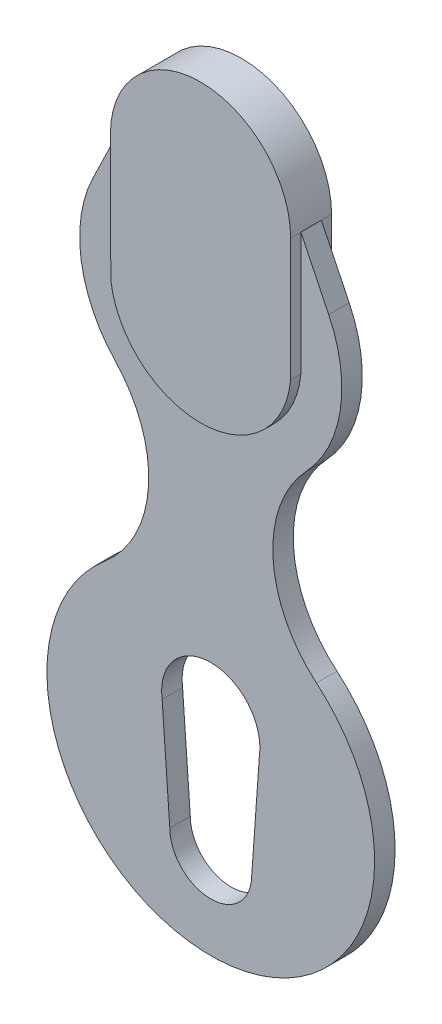
ISO-10303-21;
HEADER;
FILE_DESCRIPTION(('STEP AP214'),'2;1');
FILE_NAME('part.step','',(''),(''),'','','');
FILE_SCHEMA(('AUTOMOTIVE_DESIGN { 1 0 10303 214 1 1 1 1 }'));
ENDSEC;
DATA;
#1=APPLICATION_CONTEXT('core data for automotive mechanical design processes');
#2=APPLICATION_PROTOCOL_DEFINITION('international standard','automotive_design',2000,#1);
#3=PRODUCT_CONTEXT('',#1,'mechanical');
#4=PRODUCT('Part','Part','',(#3));
#5=PRODUCT_RELATED_PRODUCT_CATEGORY('part','',(#4));
#6=PRODUCT_DEFINITION_FORMATION('','',#4);
#7=PRODUCT_DEFINITION_CONTEXT('part definition',#1,'design');
#8=PRODUCT_DEFINITION('design','',#6,#7);
#9=PRODUCT_DEFINITION_SHAPE('','',#8);
#10=(LENGTH_UNIT() NAMED_UNIT(*) SI_UNIT(.MILLI.,.METRE.));
#11=(NAMED_UNIT(*) PLANE_ANGLE_UNIT() SI_UNIT($,.RADIAN.));
#12=(NAMED_UNIT(*) SI_UNIT($,.STERADIAN.) SOLID_ANGLE_UNIT());
#13=UNCERTAINTY_MEASURE_WITH_UNIT(LENGTH_MEASURE(1.E-05),#10,'distance_accuracy_value','');
#14=(GEOMETRIC_REPRESENTATION_CONTEXT(3) GLOBAL_UNCERTAINTY_ASSIGNED_CONTEXT((#13)) GLOBAL_UNIT_ASSIGNED_CONTEXT((#10,
#11,#12)) REPRESENTATION_CONTEXT('',''));
#15=CARTESIAN_POINT('',(0.,0.,0.));
#16=DIRECTION('',(0.,0.,1.));
#17=DIRECTION('',(1.,0.,0.));
#18=AXIS2_PLACEMENT_3D('',#15,#16,#17);
#19=CARTESIAN_POINT('',(-21.6093115242369,-0.0680474075163248,5.));
#20=DIRECTION('',(0.9999950419822,0.0031489698345894,0.));
#21=DIRECTION('',(-0.0031489698345894,0.9999950419822,0.));
#22=AXIS2_PLACEMENT_3D('',#19,#20,#21);
#23=PLANE('',#22);
#24=DIRECTION('',(0.0031489698345894,-0.999995041982199,0.));
#25=VECTOR('',#24,1.);
#26=CARTESIAN_POINT('',(-21.6093115242369,-0.0680474075163248,-2.5));
#27=LINE('',#26,#25);
#28=CARTESIAN_POINT('',(-22.,124.,-2.5));
#29=VERTEX_POINT('',#28);
#30=CARTESIAN_POINT('',(-21.9027734926598,93.1244977257462,-2.5));
#31=VERTEX_POINT('',#30);
#32=EDGE_CURVE('E277',#29,#31,#27,.T.);
#33=ORIENTED_EDGE('',*,*,#32,.F.);
#34=DIRECTION('',(0.,0.,-1.));
#35=VECTOR('',#34,1.);
#36=CARTESIAN_POINT('',(-22.,124.,5.));
#37=LINE('',#36,#35);
#38=CARTESIAN_POINT('',(-22.,124.,-5.));
#39=VERTEX_POINT('',#38);
#40=EDGE_CURVE('E347',#29,#39,#37,.T.);
#41=ORIENTED_EDGE('',*,*,#40,.T.);
#42=DIRECTION('',(0.0031489698345894,-0.999995041982199,0.));
#43=VECTOR('',#42,1.);
#44=CARTESIAN_POINT('',(-21.6093115242369,-0.0680474075163248,-5.));
#45=LINE('',#44,#43);
#46=CARTESIAN_POINT('',(-21.9027734926598,93.1244977257462,-5.));
#47=VERTEX_POINT('',#46);
#48=EDGE_CURVE('E324',#39,#47,#45,.T.);
#49=ORIENTED_EDGE('',*,*,#48,.T.);
#50=DIRECTION('',(0.,0.,-1.));
#51=VECTOR('',#50,1.);
#52=CARTESIAN_POINT('',(-21.9027734926598,93.1244977257462,5.));
#53=LINE('',#52,#51);
#54=EDGE_CURVE('E56',#31,#47,#53,.T.);
#55=ORIENTED_EDGE('',*,*,#54,.F.);
#56=EDGE_LOOP('',(#33,#41,#49,#55));
#57=FACE_BOUND('',#56,.T.);
#58=ADVANCED_FACE('F47',(#57),#23,.F.);
#59=CARTESIAN_POINT('',(0.,96.,5.));
#60=DIRECTION('',(0.,0.,-1.));
#61=DIRECTION('',(-1.,0.,0.));
#62=AXIS2_PLACEMENT_3D('',#59,#60,#61);
#63=CYLINDRICAL_SURFACE('',#62,22.0907220343745);
#64=CARTESIAN_POINT('',(0.,96.,-2.5));
#65=DIRECTION('',(0.,0.,1.));
#66=DIRECTION('',(1.,0.,0.));
#67=AXIS2_PLACEMENT_3D('',#64,#65,#66);
#68=CIRCLE('',#67,22.0907220343745);
#69=CARTESIAN_POINT('',(22.,94.,-2.5));
#70=VERTEX_POINT('',#69);
#71=EDGE_CURVE('E63',#31,#70,#68,.T.);
#72=ORIENTED_EDGE('',*,*,#71,.F.);
#73=ORIENTED_EDGE('',*,*,#54,.T.);
#74=CARTESIAN_POINT('',(0.,96.,-5.));
#75=DIRECTION('',(0.,0.,1.));
#76=DIRECTION('',(1.,0.,0.));
#77=AXIS2_PLACEMENT_3D('',#74,#75,#76);
#78=CIRCLE('',#77,22.0907220343745);
#79=CARTESIAN_POINT('',(22.,94.,-5.));
#80=VERTEX_POINT('',#79);
#81=EDGE_CURVE('E351',#47,#80,#78,.T.);
#82=ORIENTED_EDGE('',*,*,#81,.T.);
#83=DIRECTION('',(0.,0.,-1.));
#84=VECTOR('',#83,1.);
#85=CARTESIAN_POINT('',(22.,94.,5.));
#86=LINE('',#85,#84);
#87=EDGE_CURVE('E369',#70,#80,#86,.T.);
#88=ORIENTED_EDGE('',*,*,#87,.F.);
#89=EDGE_LOOP('',(#72,#73,#82,#88));
#90=FACE_BOUND('',#89,.T.);
#91=ADVANCED_FACE('F382',(#90),#63,.T.);
#92=CARTESIAN_POINT('',(22.0000000000001,0.,5.));
#93=DIRECTION('',(1.,0.,0.));
#94=DIRECTION('',(0.,1.,0.));
#95=AXIS2_PLACEMENT_3D('',#92,#93,#94);
#96=PLANE('',#95);
#97=DIRECTION('',(0.,0.,-1.));
#98=VECTOR('',#97,1.);
#99=CARTESIAN_POINT('',(22.,124.,5.));
#100=LINE('',#99,#98);
#101=CARTESIAN_POINT('',(22.,124.,-2.5));
#102=VERTEX_POINT('',#101);
#103=CARTESIAN_POINT('',(22.,124.,-5.));
#104=VERTEX_POINT('',#103);
#105=EDGE_CURVE('E365',#102,#104,#100,.T.);
#106=ORIENTED_EDGE('',*,*,#105,.F.);
#107=DIRECTION('',(0.,-1.,0.));
#108=VECTOR('',#107,1.);
#109=CARTESIAN_POINT('',(22.0000000000001,0.,-2.5));
#110=LINE('',#109,#108);
#111=EDGE_CURVE('E272',#102,#70,#110,.T.);
#112=ORIENTED_EDGE('',*,*,#111,.T.);
#113=ORIENTED_EDGE('',*,*,#87,.T.);
#114=DIRECTION('',(0.,-1.,0.));
#115=VECTOR('',#114,1.);
#116=CARTESIAN_POINT('',(22.0000000000001,0.,-5.));
#117=LINE('',#116,#115);
#118=EDGE_CURVE('E355',#104,#80,#117,.T.);
#119=ORIENTED_EDGE('',*,*,#118,.F.);
#120=EDGE_LOOP('',(#106,#112,#113,#119));
#121=FACE_BOUND('',#120,.T.);
#122=ADVANCED_FACE('F379',(#121),#96,.T.);
#123=CARTESIAN_POINT('',(-22.,124.,5.));
#124=VERTEX_POINT('',#123);
#125=CARTESIAN_POINT('',(-22.,124.,2.5));
#126=VERTEX_POINT('',#125);
#127=EDGE_CURVE('E362',#124,#126,#37,.T.);
#128=ORIENTED_EDGE('',*,*,#127,.T.);
#129=DIRECTION('',(0.0031489698345894,-0.999995041982199,0.));
#130=VECTOR('',#129,1.);
#131=CARTESIAN_POINT('',(-21.6093115242369,-0.0680474075163248,2.5));
#132=LINE('',#131,#130);
#133=CARTESIAN_POINT('',(-21.9027734926598,93.1244977257462,2.5));
#134=VERTEX_POINT('',#133);
#135=EDGE_CURVE('E71',#126,#134,#132,.T.);
#136=ORIENTED_EDGE('',*,*,#135,.T.);
#137=CARTESIAN_POINT('',(-21.9027734926598,93.1244977257462,5.));
#138=VERTEX_POINT('',#137);
#139=EDGE_CURVE('E11',#138,#134,#53,.T.);
#140=ORIENTED_EDGE('',*,*,#139,.F.);
#141=DIRECTION('',(0.0031489698345894,-0.999995041982199,0.));
#142=VECTOR('',#141,1.);
#143=CARTESIAN_POINT('',(-21.6093115242369,-0.0680474075163248,5.));
#144=LINE('',#143,#142);
#145=EDGE_CURVE('E332',#124,#138,#144,.T.);
#146=ORIENTED_EDGE('',*,*,#145,.F.);
#147=EDGE_LOOP('',(#128,#136,#140,#146));
#148=FACE_BOUND('',#147,.T.);
#149=ADVANCED_FACE('F49',(#148),#23,.F.);
#150=ORIENTED_EDGE('',*,*,#139,.T.);
#151=CARTESIAN_POINT('',(0.,96.,2.5));
#152=DIRECTION('',(0.,0.,1.));
#153=DIRECTION('',(1.,0.,0.));
#154=AXIS2_PLACEMENT_3D('',#151,#152,#153);
#155=CIRCLE('',#154,22.0907220343745);
#156=CARTESIAN_POINT('',(22.,94.,2.5));
#157=VERTEX_POINT('',#156);
#158=EDGE_CURVE('E226',#134,#157,#155,.T.);
#159=ORIENTED_EDGE('',*,*,#158,.T.);
#160=CARTESIAN_POINT('',(22.,94.,5.));
#161=VERTEX_POINT('',#160);
#162=EDGE_CURVE('E370',#161,#157,#86,.T.);
#163=ORIENTED_EDGE('',*,*,#162,.F.);
#164=CARTESIAN_POINT('',(0.,96.,5.));
#165=DIRECTION('',(0.,0.,1.));
#166=DIRECTION('',(1.,0.,0.));
#167=AXIS2_PLACEMENT_3D('',#164,#165,#166);
#168=CIRCLE('',#167,22.0907220343745);
#169=EDGE_CURVE('E336',#138,#161,#168,.T.);
#170=ORIENTED_EDGE('',*,*,#169,.F.);
#171=EDGE_LOOP('',(#150,#159,#163,#170));
#172=FACE_BOUND('',#171,.T.);
#173=ADVANCED_FACE('F409',(#172),#63,.T.);
#174=DIRECTION('',(0.,-1.,0.));
#175=VECTOR('',#174,1.);
#176=CARTESIAN_POINT('',(22.0000000000001,0.,2.5));
#177=LINE('',#176,#175);
#178=CARTESIAN_POINT('',(22.,124.,2.5));
#179=VERTEX_POINT('',#178);
#180=EDGE_CURVE('E222',#179,#157,#177,.T.);
#181=ORIENTED_EDGE('',*,*,#180,.F.);
#182=CARTESIAN_POINT('',(22.,124.,5.));
#183=VERTEX_POINT('',#182);
#184=EDGE_CURVE('E366',#183,#179,#100,.T.);
#185=ORIENTED_EDGE('',*,*,#184,.F.);
#186=DIRECTION('',(0.,-1.,0.));
#187=VECTOR('',#186,1.);
#188=CARTESIAN_POINT('',(22.0000000000001,0.,5.));
#189=LINE('',#188,#187);
#190=EDGE_CURVE('E340',#183,#161,#189,.T.);
#191=ORIENTED_EDGE('',*,*,#190,.T.);
#192=ORIENTED_EDGE('',*,*,#162,.T.);
#193=EDGE_LOOP('',(#181,#185,#191,#192));
#194=FACE_BOUND('',#193,.T.);
#195=ADVANCED_FACE('F451',(#194),#96,.T.);
#196=CARTESIAN_POINT('',(0.,124.,5.));
#197=DIRECTION('',(0.,0.,-1.));
#198=DIRECTION('',(-1.,0.,0.));
#199=AXIS2_PLACEMENT_3D('',#196,#197,#198);
#200=CYLINDRICAL_SURFACE('',#199,22.);
#201=CARTESIAN_POINT('',(0.,124.,-5.));
#202=DIRECTION('',(0.,0.,1.));
#203=DIRECTION('',(1.,0.,0.));
#204=AXIS2_PLACEMENT_3D('',#201,#202,#203);
#205=CIRCLE('',#204,22.);
#206=EDGE_CURVE('E337',#104,#39,#205,.T.);
#207=ORIENTED_EDGE('',*,*,#206,.T.);
#208=ORIENTED_EDGE('',*,*,#40,.F.);
#209=DIRECTION('',(0.,0.,-1.));
#210=VECTOR('',#209,1.);
#211=CARTESIAN_POINT('',(-22.,124.,2.5));
#212=LINE('',#211,#210);
#213=EDGE_CURVE('E310',#126,#29,#212,.T.);
#214=ORIENTED_EDGE('',*,*,#213,.F.);
#215=ORIENTED_EDGE('',*,*,#127,.F.);
#216=CARTESIAN_POINT('',(0.,124.,5.));
#217=DIRECTION('',(0.,0.,1.));
#218=DIRECTION('',(1.,0.,0.));
#219=AXIS2_PLACEMENT_3D('',#216,#217,#218);
#220=CIRCLE('',#219,22.);
#221=EDGE_CURVE('E344',#183,#124,#220,.T.);
#222=ORIENTED_EDGE('',*,*,#221,.F.);
#223=ORIENTED_EDGE('',*,*,#184,.T.);
#224=DIRECTION('',(0.,0.,-1.));
#225=VECTOR('',#224,1.);
#226=CARTESIAN_POINT('',(22.,124.,2.5));
#227=LINE('',#226,#225);
#228=EDGE_CURVE('E314',#179,#102,#227,.T.);
#229=ORIENTED_EDGE('',*,*,#228,.T.);
#230=ORIENTED_EDGE('',*,*,#105,.T.);
#231=EDGE_LOOP('',(#207,#208,#214,#215,#222,#223,#229,#230));
#232=FACE_BOUND('',#231,.T.);
#233=ADVANCED_FACE('F388',(#232),#200,.T.);
#234=CARTESIAN_POINT('',(0.,0.,5.));
#235=DIRECTION('',(0.,0.,1.));
#236=DIRECTION('',(1.,0.,0.));
#237=AXIS2_PLACEMENT_3D('',#234,#235,#236);
#238=PLANE('',#237);
#239=ORIENTED_EDGE('',*,*,#145,.T.);
#240=ORIENTED_EDGE('',*,*,#169,.T.);
#241=ORIENTED_EDGE('',*,*,#190,.F.);
#242=ORIENTED_EDGE('',*,*,#221,.T.);
#243=EDGE_LOOP('',(#239,#240,#241,#242));
#244=FACE_BOUND('',#243,.T.);
#245=ADVANCED_FACE('F412',(#244),#238,.T.);
#246=CARTESIAN_POINT('',(0.,0.,-5.));
#247=DIRECTION('',(0.,0.,1.));
#248=DIRECTION('',(1.,0.,0.));
#249=AXIS2_PLACEMENT_3D('',#246,#247,#248);
#250=PLANE('',#249);
#251=ORIENTED_EDGE('',*,*,#48,.F.);
#252=ORIENTED_EDGE('',*,*,#206,.F.);
#253=ORIENTED_EDGE('',*,*,#118,.T.);
#254=ORIENTED_EDGE('',*,*,#81,.F.);
#255=EDGE_LOOP('',(#251,#252,#253,#254));
#256=FACE_BOUND('',#255,.T.);
#257=ADVANCED_FACE('F386',(#256),#250,.F.);
#258=CARTESIAN_POINT('',(45.1414443721067,53.5,2.5));
#259=DIRECTION('',(0.,0.,-1.));
#260=DIRECTION('',(-1.,0.,0.));
#261=AXIS2_PLACEMENT_3D('',#258,#259,#260);
#262=CYLINDRICAL_SURFACE('',#261,30.);
#263=CARTESIAN_POINT('',(45.1414443721067,53.5,-2.5));
#264=DIRECTION('',(0.,0.,1.));
#265=DIRECTION('',(1.,0.,0.));
#266=AXIS2_PLACEMENT_3D('',#263,#264,#265);
#267=CIRCLE('',#266,30.);
#268=CARTESIAN_POINT('',(23.2988099985067,74.0645161290323,-2.5));
#269=VERTEX_POINT('',#268);
#270=CARTESIAN_POINT('',(25.7951110697752,30.5714285714286,-2.5));
#271=VERTEX_POINT('',#270);
#272=EDGE_CURVE('E260',#269,#271,#267,.T.);
#273=ORIENTED_EDGE('',*,*,#272,.F.);
#274=DIRECTION('',(0.,0.,-1.));
#275=VECTOR('',#274,1.);
#276=CARTESIAN_POINT('',(23.2988099985067,74.0645161290323,2.5));
#277=LINE('',#276,#275);
#278=CARTESIAN_POINT('',(23.2988099985067,74.0645161290323,2.5));
#279=VERTEX_POINT('',#278);
#280=EDGE_CURVE('E321',#279,#269,#277,.T.);
#281=ORIENTED_EDGE('',*,*,#280,.F.);
#282=CARTESIAN_POINT('',(45.1414443721067,53.5,2.5));
#283=DIRECTION('',(0.,0.,1.));
#284=DIRECTION('',(1.,0.,0.));
#285=AXIS2_PLACEMENT_3D('',#282,#283,#284);
#286=CIRCLE('',#285,30.);
#287=CARTESIAN_POINT('',(25.7951110697752,30.5714285714286,2.5));
#288=VERTEX_POINT('',#287);
#289=EDGE_CURVE('E211',#279,#288,#286,.T.);
#290=ORIENTED_EDGE('',*,*,#289,.T.);
#291=DIRECTION('',(0.,0.,-1.));
#292=VECTOR('',#291,1.);
#293=CARTESIAN_POINT('',(25.7951110697752,30.5714285714286,2.5));
#294=LINE('',#293,#292);
#295=EDGE_CURVE('E186',#288,#271,#294,.T.);
#296=ORIENTED_EDGE('',*,*,#295,.T.);
#297=EDGE_LOOP('',(#273,#281,#290,#296));
#298=FACE_BOUND('',#297,.T.);
#299=ADVANCED_FACE('F425',(#298),#262,.F.);
#300=CARTESIAN_POINT('',(0.,96.,2.5));
#301=DIRECTION('',(0.,0.,-1.));
#302=DIRECTION('',(-1.,0.,0.));
#303=AXIS2_PLACEMENT_3D('',#300,#301,#302);
#304=CYLINDRICAL_SURFACE('',#303,32.);
#305=CARTESIAN_POINT('',(0.,96.,-2.5));
#306=DIRECTION('',(0.,0.,1.));
#307=DIRECTION('',(1.,0.,0.));
#308=AXIS2_PLACEMENT_3D('',#305,#306,#307);
#309=CIRCLE('',#308,32.);
#310=CARTESIAN_POINT('',(28.8043907091678,109.93940729994,-2.5));
#311=VERTEX_POINT('',#310);
#312=EDGE_CURVE('E264',#269,#311,#309,.T.);
#313=ORIENTED_EDGE('',*,*,#312,.T.);
#314=DIRECTION('',(0.,0.,-1.));
#315=VECTOR('',#314,1.);
#316=CARTESIAN_POINT('',(28.8043907091678,109.93940729994,2.5));
#317=LINE('',#316,#315);
#318=CARTESIAN_POINT('',(28.8043907091678,109.93940729994,2.5));
#319=VERTEX_POINT('',#318);
#320=EDGE_CURVE('E318',#319,#311,#317,.T.);
#321=ORIENTED_EDGE('',*,*,#320,.F.);
#322=CARTESIAN_POINT('',(0.,96.,2.5));
#323=DIRECTION('',(0.,0.,1.));
#324=DIRECTION('',(1.,0.,0.));
#325=AXIS2_PLACEMENT_3D('',#322,#323,#324);
#326=CIRCLE('',#325,32.);
#327=EDGE_CURVE('E215',#279,#319,#326,.T.);
#328=ORIENTED_EDGE('',*,*,#327,.F.);
#329=ORIENTED_EDGE('',*,*,#280,.T.);
#330=EDGE_LOOP('',(#313,#321,#328,#329));
#331=FACE_BOUND('',#330,.T.);
#332=ADVANCED_FACE('F421',(#331),#304,.T.);
#333=CARTESIAN_POINT('',(66.4465282830759,32.1556956630907,2.5));
#334=DIRECTION('',(0.900137209661492,0.435606478123114,0.));
#335=DIRECTION('',(-0.435606478123114,0.900137209661492,0.));
#336=AXIS2_PLACEMENT_3D('',#333,#334,#335);
#337=PLANE('',#336);
#338=DIRECTION('',(0.435606478123114,-0.900137209661492,0.));
#339=VECTOR('',#338,1.);
#340=CARTESIAN_POINT('',(66.4465282830759,32.1556956630907,-2.5));
#341=LINE('',#340,#339);
#342=EDGE_CURVE('E268',#102,#311,#341,.T.);
#343=ORIENTED_EDGE('',*,*,#342,.F.);
#344=ORIENTED_EDGE('',*,*,#228,.F.);
#345=DIRECTION('',(0.435606478123114,-0.900137209661492,0.));
#346=VECTOR('',#345,1.);
#347=CARTESIAN_POINT('',(66.4465282830759,32.1556956630907,2.5));
#348=LINE('',#347,#346);
#349=EDGE_CURVE('E218',#179,#319,#348,.T.);
#350=ORIENTED_EDGE('',*,*,#349,.T.);
#351=ORIENTED_EDGE('',*,*,#320,.T.);
#352=EDGE_LOOP('',(#343,#344,#350,#351));
#353=FACE_BOUND('',#352,.T.);
#354=ADVANCED_FACE('F417',(#353),#337,.T.);
#355=CARTESIAN_POINT('',(-66.446528283076,32.1556956630909,2.5));
#356=DIRECTION('',(0.900137209661491,-0.435606478123116,0.));
#357=DIRECTION('',(0.435606478123116,0.900137209661491,0.));
#358=AXIS2_PLACEMENT_3D('',#355,#356,#357);
#359=PLANE('',#358);
#360=DIRECTION('',(-0.435606478123116,-0.900137209661491,0.));
#361=VECTOR('',#360,1.);
#362=CARTESIAN_POINT('',(-66.446528283076,32.1556956630909,-2.5));
#363=LINE('',#362,#361);
#364=CARTESIAN_POINT('',(-28.8043907091678,109.93940729994,-2.5));
#365=VERTEX_POINT('',#364);
#366=EDGE_CURVE('E281',#29,#365,#363,.T.);
#367=ORIENTED_EDGE('',*,*,#366,.T.);
#368=DIRECTION('',(0.,0.,-1.));
#369=VECTOR('',#368,1.);
#370=CARTESIAN_POINT('',(-28.8043907091678,109.93940729994,2.5));
#371=LINE('',#370,#369);
#372=CARTESIAN_POINT('',(-28.8043907091678,109.93940729994,2.5));
#373=VERTEX_POINT('',#372);
#374=EDGE_CURVE('E306',#373,#365,#371,.T.);
#375=ORIENTED_EDGE('',*,*,#374,.F.);
#376=DIRECTION('',(-0.435606478123116,-0.900137209661491,0.));
#377=VECTOR('',#376,1.);
#378=CARTESIAN_POINT('',(-66.446528283076,32.1556956630909,2.5));
#379=LINE('',#378,#377);
#380=EDGE_CURVE('E231',#126,#373,#379,.T.);
#381=ORIENTED_EDGE('',*,*,#380,.F.);
#382=ORIENTED_EDGE('',*,*,#213,.T.);
#383=EDGE_LOOP('',(#367,#375,#381,#382));
#384=FACE_BOUND('',#383,.T.);
#385=ADVANCED_FACE('F398',(#384),#359,.F.);
#386=CARTESIAN_POINT('',(0.,96.,2.5));
#387=DIRECTION('',(0.,0.,-1.));
#388=DIRECTION('',(-1.,0.,0.));
#389=AXIS2_PLACEMENT_3D('',#386,#387,#388);
#390=CYLINDRICAL_SURFACE('',#389,32.);
#391=CARTESIAN_POINT('',(0.,96.,-2.5));
#392=DIRECTION('',(0.,0.,1.));
#393=DIRECTION('',(1.,0.,0.));
#394=AXIS2_PLACEMENT_3D('',#391,#392,#393);
#395=CIRCLE('',#394,32.);
#396=CARTESIAN_POINT('',(-23.2988099985067,74.0645161290323,-2.5));
#397=VERTEX_POINT('',#396);
#398=EDGE_CURVE('E285',#365,#397,#395,.T.);
#399=ORIENTED_EDGE('',*,*,#398,.T.);
#400=DIRECTION('',(0.,0.,-1.));
#401=VECTOR('',#400,1.);
#402=CARTESIAN_POINT('',(-23.2988099985067,74.0645161290323,2.5));
#403=LINE('',#402,#401);
#404=CARTESIAN_POINT('',(-23.2988099985067,74.0645161290323,2.5));
#405=VERTEX_POINT('',#404);
#406=EDGE_CURVE('E302',#405,#397,#403,.T.);
#407=ORIENTED_EDGE('',*,*,#406,.F.);
#408=CARTESIAN_POINT('',(0.,96.,2.5));
#409=DIRECTION('',(0.,0.,1.));
#410=DIRECTION('',(1.,0.,0.));
#411=AXIS2_PLACEMENT_3D('',#408,#409,#410);
#412=CIRCLE('',#411,32.);
#413=EDGE_CURVE('E235',#373,#405,#412,.T.);
#414=ORIENTED_EDGE('',*,*,#413,.F.);
#415=ORIENTED_EDGE('',*,*,#374,.T.);
#416=EDGE_LOOP('',(#399,#407,#414,#415));
#417=FACE_BOUND('',#416,.T.);
#418=ADVANCED_FACE('F404',(#417),#390,.T.);
#419=CARTESIAN_POINT('',(-45.1414443721067,53.5,2.5));
#420=DIRECTION('',(0.,0.,-1.));
#421=DIRECTION('',(-1.,0.,0.));
#422=AXIS2_PLACEMENT_3D('',#419,#420,#421);
#423=CYLINDRICAL_SURFACE('',#422,30.);
#424=CARTESIAN_POINT('',(-45.1414443721067,53.5,-2.5));
#425=DIRECTION('',(0.,0.,1.));
#426=DIRECTION('',(1.,0.,0.));
#427=AXIS2_PLACEMENT_3D('',#424,#425,#426);
#428=CIRCLE('',#427,30.);
#429=CARTESIAN_POINT('',(-25.7951110697752,30.5714285714286,-2.5));
#430=VERTEX_POINT('',#429);
#431=EDGE_CURVE('E289',#397,#430,#428,.F.);
#432=ORIENTED_EDGE('',*,*,#431,.T.);
#433=DIRECTION('',(0.,0.,-1.));
#434=VECTOR('',#433,1.);
#435=CARTESIAN_POINT('',(-25.7951110697752,30.5714285714286,2.5));
#436=LINE('',#435,#434);
#437=CARTESIAN_POINT('',(-25.7951110697752,30.5714285714286,2.5));
#438=VERTEX_POINT('',#437);
#439=EDGE_CURVE('E298',#438,#430,#436,.T.);
#440=ORIENTED_EDGE('',*,*,#439,.F.);
#441=CARTESIAN_POINT('',(-45.1414443721067,53.5,2.5));
#442=DIRECTION('',(0.,0.,1.));
#443=DIRECTION('',(1.,0.,0.));
#444=AXIS2_PLACEMENT_3D('',#441,#442,#443);
#445=CIRCLE('',#444,30.);
#446=EDGE_CURVE('E239',#405,#438,#445,.F.);
#447=ORIENTED_EDGE('',*,*,#446,.F.);
#448=ORIENTED_EDGE('',*,*,#406,.T.);
#449=EDGE_LOOP('',(#432,#440,#447,#448));
#450=FACE_BOUND('',#449,.T.);
#451=ADVANCED_FACE('F431',(#450),#423,.F.);
#452=CARTESIAN_POINT('',(0.,-18.,2.5));
#453=DIRECTION('',(0.,0.,-1.));
#454=DIRECTION('',(-1.,0.,0.));
#455=AXIS2_PLACEMENT_3D('',#452,#453,#454);
#456=CYLINDRICAL_SURFACE('',#455,10.);
#457=CARTESIAN_POINT('',(0.,-18.,-2.5));
#458=DIRECTION('',(0.,0.,1.));
#459=DIRECTION('',(1.,0.,0.));
#460=AXIS2_PLACEMENT_3D('',#457,#458,#459);
#461=CIRCLE('',#460,10.);
#462=CARTESIAN_POINT('',(-10.,-18.,-2.5));
#463=VERTEX_POINT('',#462);
#464=CARTESIAN_POINT('',(10.,-18.,-2.5));
#465=VERTEX_POINT('',#464);
#466=EDGE_CURVE('E180',#463,#465,#461,.T.);
#467=ORIENTED_EDGE('',*,*,#466,.F.);
#468=DIRECTION('',(0.,0.,-1.));
#469=VECTOR('',#468,1.);
#470=CARTESIAN_POINT('',(-10.,-18.,2.5));
#471=LINE('',#470,#469);
#472=CARTESIAN_POINT('',(-10.,-18.,2.5));
#473=VERTEX_POINT('',#472);
#474=EDGE_CURVE('E175',#473,#463,#471,.T.);
#475=ORIENTED_EDGE('',*,*,#474,.F.);
#476=CARTESIAN_POINT('',(0.,-18.,2.5));
#477=DIRECTION('',(0.,0.,1.));
#478=DIRECTION('',(1.,0.,0.));
#479=AXIS2_PLACEMENT_3D('',#476,#477,#478);
#480=CIRCLE('',#479,10.);
#481=CARTESIAN_POINT('',(10.,-18.,2.5));
#482=VERTEX_POINT('',#481);
#483=EDGE_CURVE('E178',#473,#482,#480,.T.);
#484=ORIENTED_EDGE('',*,*,#483,.T.);
#485=DIRECTION('',(0.,0.,-1.));
#486=VECTOR('',#485,1.);
#487=CARTESIAN_POINT('',(10.,-18.,2.5));
#488=LINE('',#487,#486);
#489=EDGE_CURVE('E246',#482,#465,#488,.T.);
#490=ORIENTED_EDGE('',*,*,#489,.T.);
#491=EDGE_LOOP('',(#467,#475,#484,#490));
#492=FACE_BOUND('',#491,.T.);
#493=ADVANCED_FACE('F177',(#492),#456,.F.);
#494=CARTESIAN_POINT('',(-11.2284263959391,-0.802030456852791,2.5));
#495=DIRECTION('',(0.997458699830735,0.0712470499879096,0.));
#496=DIRECTION('',(-0.0712470499879096,0.997458699830735,0.));
#497=AXIS2_PLACEMENT_3D('',#494,#495,#496);
#498=PLANE('',#497);
#499=DIRECTION('',(0.0712470499879096,-0.997458699830735,0.));
#500=VECTOR('',#499,1.);
#501=CARTESIAN_POINT('',(-11.2284263959391,-0.802030456852791,-2.5));
#502=LINE('',#501,#500);
#503=CARTESIAN_POINT('',(-11.8781725888325,8.29441624365481,-2.5));
#504=VERTEX_POINT('',#503);
#505=EDGE_CURVE('E249',#504,#463,#502,.T.);
#506=ORIENTED_EDGE('',*,*,#505,.F.);
#507=DIRECTION('',(0.,0.,-1.));
#508=VECTOR('',#507,1.);
#509=CARTESIAN_POINT('',(-11.8781725888325,8.29441624365481,2.5));
#510=LINE('',#509,#508);
#511=CARTESIAN_POINT('',(-11.8781725888325,8.29441624365481,2.5));
#512=VERTEX_POINT('',#511);
#513=EDGE_CURVE('E187',#512,#504,#510,.T.);
#514=ORIENTED_EDGE('',*,*,#513,.F.);
#515=DIRECTION('',(0.0712470499879096,-0.997458699830735,0.));
#516=VECTOR('',#515,1.);
#517=CARTESIAN_POINT('',(-11.2284263959391,-0.802030456852791,2.5));
#518=LINE('',#517,#516);
#519=EDGE_CURVE('E194',#512,#473,#518,.T.);
#520=ORIENTED_EDGE('',*,*,#519,.T.);
#521=ORIENTED_EDGE('',*,*,#474,.T.);
#522=EDGE_LOOP('',(#506,#514,#520,#521));
#523=FACE_BOUND('',#522,.T.);
#524=ADVANCED_FACE('F202',(#523),#498,.T.);
#525=CARTESIAN_POINT('',(0.,10.,2.5));
#526=DIRECTION('',(0.,0.,-1.));
#527=DIRECTION('',(-1.,0.,0.));
#528=AXIS2_PLACEMENT_3D('',#525,#526,#527);
#529=CYLINDRICAL_SURFACE('',#528,12.);
#530=CARTESIAN_POINT('',(0.,10.,-2.5));
#531=DIRECTION('',(0.,0.,1.));
#532=DIRECTION('',(1.,0.,0.));
#533=AXIS2_PLACEMENT_3D('',#530,#531,#532);
#534=CIRCLE('',#533,12.);
#535=CARTESIAN_POINT('',(11.8781725888325,8.29441624365481,-2.5));
#536=VERTEX_POINT('',#535);
#537=EDGE_CURVE('E252',#536,#504,#534,.T.);
#538=ORIENTED_EDGE('',*,*,#537,.F.);
#539=DIRECTION('',(0.,0.,-1.));
#540=VECTOR('',#539,1.);
#541=CARTESIAN_POINT('',(11.8781725888325,8.29441624365481,2.5));
#542=LINE('',#541,#540);
#543=CARTESIAN_POINT('',(11.8781725888325,8.29441624365481,2.5));
#544=VERTEX_POINT('',#543);
#545=EDGE_CURVE('E327',#544,#536,#542,.T.);
#546=ORIENTED_EDGE('',*,*,#545,.F.);
#547=CARTESIAN_POINT('',(0.,10.,2.5));
#548=DIRECTION('',(0.,0.,1.));
#549=DIRECTION('',(1.,0.,0.));
#550=AXIS2_PLACEMENT_3D('',#547,#548,#549);
#551=CIRCLE('',#550,12.);
#552=EDGE_CURVE('E204',#544,#512,#551,.T.);
#553=ORIENTED_EDGE('',*,*,#552,.T.);
#554=ORIENTED_EDGE('',*,*,#513,.T.);
#555=EDGE_LOOP('',(#538,#546,#553,#554));
#556=FACE_BOUND('',#555,.T.);
#557=ADVANCED_FACE('F469',(#556),#529,.F.);
#558=CARTESIAN_POINT('',(11.2284263959391,-0.802030456852791,2.5));
#559=DIRECTION('',(0.997458699830735,-0.0712470499879096,0.));
#560=DIRECTION('',(0.0712470499879096,0.997458699830735,0.));
#561=AXIS2_PLACEMENT_3D('',#558,#559,#560);
#562=PLANE('',#561);
#563=DIRECTION('',(-0.0712470499879096,-0.997458699830735,0.));
#564=VECTOR('',#563,1.);
#565=CARTESIAN_POINT('',(11.2284263959391,-0.802030456852791,-2.5));
#566=LINE('',#565,#564);
#567=EDGE_CURVE('E256',#536,#465,#566,.T.);
#568=ORIENTED_EDGE('',*,*,#567,.T.);
#569=ORIENTED_EDGE('',*,*,#489,.F.);
#570=DIRECTION('',(-0.0712470499879096,-0.997458699830735,0.));
#571=VECTOR('',#570,1.);
#572=CARTESIAN_POINT('',(11.2284263959391,-0.802030456852791,2.5));
#573=LINE('',#572,#571);
#574=EDGE_CURVE('E197',#544,#482,#573,.T.);
#575=ORIENTED_EDGE('',*,*,#574,.F.);
#576=ORIENTED_EDGE('',*,*,#545,.T.);
#577=EDGE_LOOP('',(#568,#569,#575,#576));
#578=FACE_BOUND('',#577,.T.);
#579=ADVANCED_FACE('F472',(#578),#562,.F.);
#580=CARTESIAN_POINT('',(0.,0.,2.5));
#581=DIRECTION('',(0.,0.,-1.));
#582=DIRECTION('',(-1.,0.,0.));
#583=AXIS2_PLACEMENT_3D('',#580,#581,#582);
#584=CYLINDRICAL_SURFACE('',#583,40.);
#585=CARTESIAN_POINT('',(0.,0.,-2.5));
#586=DIRECTION('',(0.,0.,1.));
#587=DIRECTION('',(1.,0.,0.));
#588=AXIS2_PLACEMENT_3D('',#585,#586,#587);
#589=CIRCLE('',#588,40.);
#590=EDGE_CURVE('E200',#430,#271,#589,.T.);
#591=ORIENTED_EDGE('',*,*,#590,.T.);
#592=ORIENTED_EDGE('',*,*,#295,.F.);
#593=CARTESIAN_POINT('',(0.,0.,2.5));
#594=DIRECTION('',(0.,0.,1.));
#595=DIRECTION('',(1.,0.,0.));
#596=AXIS2_PLACEMENT_3D('',#593,#594,#595);
#597=CIRCLE('',#596,40.);
#598=EDGE_CURVE('E243',#438,#288,#597,.T.);
#599=ORIENTED_EDGE('',*,*,#598,.F.);
#600=ORIENTED_EDGE('',*,*,#439,.T.);
#601=EDGE_LOOP('',(#591,#592,#599,#600));
#602=FACE_BOUND('',#601,.T.);
#603=ADVANCED_FACE('F428',(#602),#584,.T.);
#604=CARTESIAN_POINT('',(0.,0.,2.5));
#605=DIRECTION('',(0.,0.,1.));
#606=DIRECTION('',(1.,0.,0.));
#607=AXIS2_PLACEMENT_3D('',#604,#605,#606);
#608=PLANE('',#607);
#609=ORIENTED_EDGE('',*,*,#483,.F.);
#610=ORIENTED_EDGE('',*,*,#519,.F.);
#611=ORIENTED_EDGE('',*,*,#552,.F.);
#612=ORIENTED_EDGE('',*,*,#574,.T.);
#613=EDGE_LOOP('',(#609,#610,#611,#612));
#614=FACE_BOUND('',#613,.T.);
#615=ORIENTED_EDGE('',*,*,#289,.F.);
#616=ORIENTED_EDGE('',*,*,#327,.T.);
#617=ORIENTED_EDGE('',*,*,#349,.F.);
#618=ORIENTED_EDGE('',*,*,#180,.T.);
#619=ORIENTED_EDGE('',*,*,#158,.F.);
#620=ORIENTED_EDGE('',*,*,#135,.F.);
#621=ORIENTED_EDGE('',*,*,#380,.T.);
#622=ORIENTED_EDGE('',*,*,#413,.T.);
#623=ORIENTED_EDGE('',*,*,#446,.T.);
#624=ORIENTED_EDGE('',*,*,#598,.T.);
#625=EDGE_LOOP('',(#615,#616,#617,#618,#619,#620,#621,#622,#623,#624));
#626=FACE_BOUND('',#625,.T.);
#627=ADVANCED_FACE('F191',(#614,#626),#608,.T.);
#628=CARTESIAN_POINT('',(0.,0.,-2.5));
#629=DIRECTION('',(0.,0.,1.));
#630=DIRECTION('',(1.,0.,0.));
#631=AXIS2_PLACEMENT_3D('',#628,#629,#630);
#632=PLANE('',#631);
#633=ORIENTED_EDGE('',*,*,#466,.T.);
#634=ORIENTED_EDGE('',*,*,#567,.F.);
#635=ORIENTED_EDGE('',*,*,#537,.T.);
#636=ORIENTED_EDGE('',*,*,#505,.T.);
#637=EDGE_LOOP('',(#633,#634,#635,#636));
#638=FACE_BOUND('',#637,.T.);
#639=ORIENTED_EDGE('',*,*,#272,.T.);
#640=ORIENTED_EDGE('',*,*,#590,.F.);
#641=ORIENTED_EDGE('',*,*,#431,.F.);
#642=ORIENTED_EDGE('',*,*,#398,.F.);
#643=ORIENTED_EDGE('',*,*,#366,.F.);
#644=ORIENTED_EDGE('',*,*,#32,.T.);
#645=ORIENTED_EDGE('',*,*,#71,.T.);
#646=ORIENTED_EDGE('',*,*,#111,.F.);
#647=ORIENTED_EDGE('',*,*,#342,.T.);
#648=ORIENTED_EDGE('',*,*,#312,.F.);
#649=EDGE_LOOP('',(#639,#640,#641,#642,#643,#644,#645,#646,#647,#648));
#650=FACE_BOUND('',#649,.T.);
#651=ADVANCED_FACE('F401',(#638,#650),#632,.F.);
#652=CLOSED_SHELL('',(#58,#91,#122,#149,#173,#195,#233,#245,#257,#299,#332,#354,#385,#418,#451,
#493,#524,#557,#579,#603,#627,#651));
#653=MANIFOLD_SOLID_BREP('B2',#652);
#654=ADVANCED_BREP_SHAPE_REPRESENTATION('',(#18,#653),#14);
#655=SHAPE_DEFINITION_REPRESENTATION(#9,#654);
ENDSEC;
END-ISO-10303-21;
